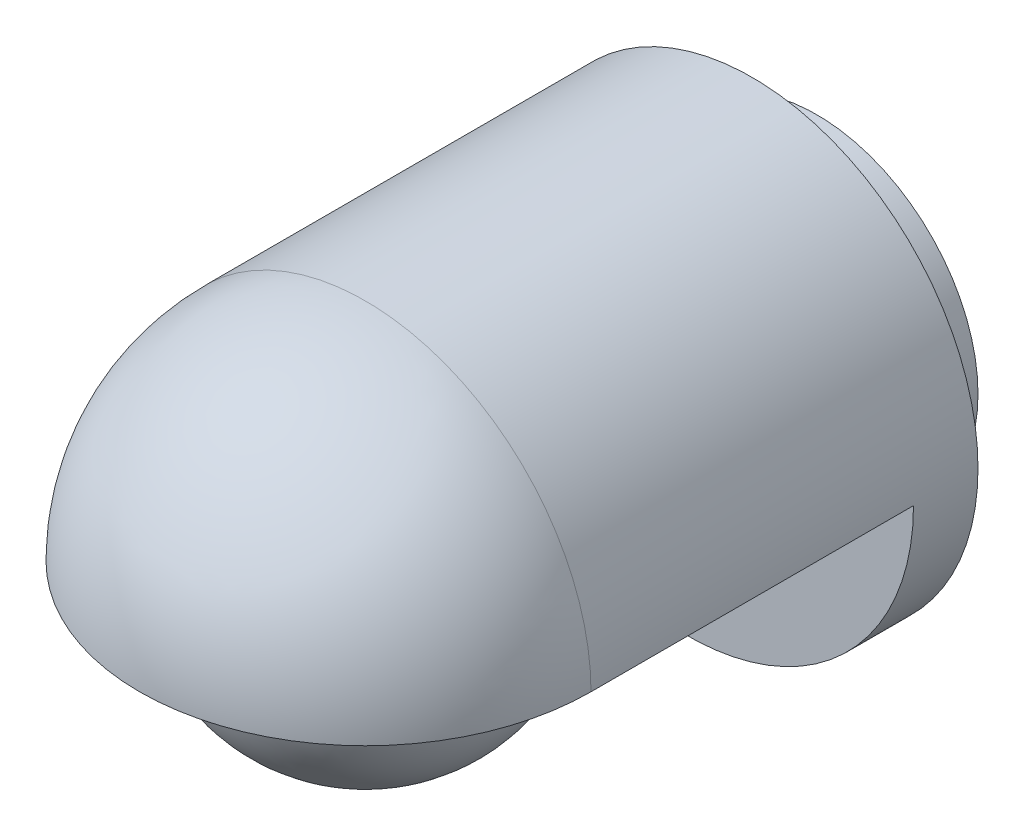
ISO-10303-21;
HEADER;
FILE_DESCRIPTION(('STEP AP214'),'2;1');
FILE_NAME('part.step','',(''),(''),'','','');
FILE_SCHEMA(('AUTOMOTIVE_DESIGN { 1 0 10303 214 1 1 1 1 }'));
ENDSEC;
DATA;
#1=APPLICATION_CONTEXT('core data for automotive mechanical design processes');
#2=APPLICATION_PROTOCOL_DEFINITION('international standard','automotive_design',2000,#1);
#3=PRODUCT_CONTEXT('',#1,'mechanical');
#4=PRODUCT('Part','Part','',(#3));
#5=PRODUCT_RELATED_PRODUCT_CATEGORY('part','',(#4));
#6=PRODUCT_DEFINITION_FORMATION('','',#4);
#7=PRODUCT_DEFINITION_CONTEXT('part definition',#1,'design');
#8=PRODUCT_DEFINITION('design','',#6,#7);
#9=PRODUCT_DEFINITION_SHAPE('','',#8);
#10=(LENGTH_UNIT() NAMED_UNIT(*) SI_UNIT(.MILLI.,.METRE.));
#11=(NAMED_UNIT(*) PLANE_ANGLE_UNIT() SI_UNIT($,.RADIAN.));
#12=(NAMED_UNIT(*) SI_UNIT($,.STERADIAN.) SOLID_ANGLE_UNIT());
#13=UNCERTAINTY_MEASURE_WITH_UNIT(LENGTH_MEASURE(1.E-05),#10,'distance_accuracy_value','');
#14=(GEOMETRIC_REPRESENTATION_CONTEXT(3) GLOBAL_UNCERTAINTY_ASSIGNED_CONTEXT((#13)) GLOBAL_UNIT_ASSIGNED_CONTEXT((#10,
#11,#12)) REPRESENTATION_CONTEXT('',''));
#15=CARTESIAN_POINT('',(0.,0.,0.));
#16=DIRECTION('',(0.,0.,1.));
#17=DIRECTION('',(1.,0.,0.));
#18=AXIS2_PLACEMENT_3D('',#15,#16,#17);
#19=CARTESIAN_POINT('',(0.,0.,0.));
#20=DIRECTION('',(0.,-1.,0.));
#21=DIRECTION('',(0.,0.,1.));
#22=AXIS2_PLACEMENT_3D('',#19,#20,#21);
#23=PLANE('',#22);
#24=CARTESIAN_POINT('',(0.,0.,0.));
#25=DIRECTION('',(0.,-1.,0.));
#26=DIRECTION('',(1.,0.,0.));
#27=AXIS2_PLACEMENT_3D('',#24,#25,#26);
#28=CIRCLE('',#27,50.);
#29=CARTESIAN_POINT('',(50.,-3.49148133884313E-13,0.));
#30=VERTEX_POINT('',#29);
#31=EDGE_CURVE('E42',#30,#30,#28,.F.);
#32=ORIENTED_EDGE('',*,*,#31,.T.);
#33=EDGE_LOOP('',(#32));
#34=FACE_BOUND('',#33,.T.);
#35=DIRECTION('',(0.,0.,-1.));
#36=VECTOR('',#35,1.);
#37=CARTESIAN_POINT('',(-70.,0.,0.));
#38=LINE('',#37,#36);
#39=CARTESIAN_POINT('',(-70.,0.,0.));
#40=VERTEX_POINT('',#39);
#41=CARTESIAN_POINT('',(-70.,4.88807387438039E-13,-100.));
#42=VERTEX_POINT('',#41);
#43=EDGE_CURVE('E67',#40,#42,#38,.T.);
#44=ORIENTED_EDGE('',*,*,#43,.T.);
#45=DIRECTION('',(1.,0.,0.));
#46=VECTOR('',#45,1.);
#47=CARTESIAN_POINT('',(0.,0.,-100.));
#48=LINE('',#47,#46);
#49=CARTESIAN_POINT('',(70.,-4.88807387438039E-13,-100.));
#50=VERTEX_POINT('',#49);
#51=EDGE_CURVE('E11',#42,#50,#48,.T.);
#52=ORIENTED_EDGE('',*,*,#51,.T.);
#53=DIRECTION('',(0.,0.,-1.));
#54=VECTOR('',#53,1.);
#55=CARTESIAN_POINT('',(70.,-4.88807387438039E-13,0.));
#56=LINE('',#55,#54);
#57=CARTESIAN_POINT('',(70.,-4.88807387438039E-13,0.));
#58=VERTEX_POINT('',#57);
#59=EDGE_CURVE('E68',#58,#50,#56,.T.);
#60=ORIENTED_EDGE('',*,*,#59,.F.);
#61=CARTESIAN_POINT('',(0.,0.,0.));
#62=DIRECTION('',(0.,-1.,0.));
#63=DIRECTION('',(0.,0.,1.));
#64=AXIS2_PLACEMENT_3D('',#61,#62,#63);
#65=CIRCLE('',#64,70.);
#66=EDGE_CURVE('E56',#58,#40,#65,.T.);
#67=ORIENTED_EDGE('',*,*,#66,.T.);
#68=EDGE_LOOP('',(#44,#52,#60,#67));
#69=FACE_BOUND('',#68,.T.);
#70=ADVANCED_FACE('F34',(#34,#69),#23,.T.);
#71=CARTESIAN_POINT('',(0.,0.,0.));
#72=DIRECTION('',(0.,0.,-1.));
#73=DIRECTION('',(1.,0.,0.));
#74=AXIS2_PLACEMENT_3D('',#71,#72,#73);
#75=SPHERICAL_SURFACE('',#74,50.);
#76=CARTESIAN_POINT('',(0.,0.,0.));
#77=DIRECTION('',(0.,-1.,0.));
#78=DIRECTION('',(1.,0.,0.));
#79=AXIS2_PLACEMENT_3D('',#76,#77,#78);
#80=SPHERICAL_SURFACE('',#79,50.);
#81=ORIENTED_EDGE('',*,*,#31,.F.);
#82=EDGE_LOOP('',(#81));
#83=FACE_BOUND('',#82,.T.);
#84=ADVANCED_FACE('F36',(#83),#80,.T.);
#85=CARTESIAN_POINT('',(0.,0.,-120.));
#86=DIRECTION('',(0.,0.,1.));
#87=DIRECTION('',(1.,0.,0.));
#88=AXIS2_PLACEMENT_3D('',#85,#86,#87);
#89=CYLINDRICAL_SURFACE('',#88,70.);
#90=CARTESIAN_POINT('',(0.,0.,-120.));
#91=DIRECTION('',(0.,0.,1.));
#92=DIRECTION('',(1.,0.,0.));
#93=AXIS2_PLACEMENT_3D('',#90,#91,#92);
#94=CIRCLE('',#93,70.);
#95=CARTESIAN_POINT('',(70.,0.,-120.));
#96=VERTEX_POINT('',#95);
#97=EDGE_CURVE('E79',#96,#96,#94,.T.);
#98=ORIENTED_EDGE('',*,*,#97,.T.);
#99=EDGE_LOOP('',(#98));
#100=FACE_BOUND('',#99,.T.);
#101=CARTESIAN_POINT('',(0.,0.,-100.));
#102=DIRECTION('',(0.,0.,-1.));
#103=DIRECTION('',(-1.,0.,0.));
#104=AXIS2_PLACEMENT_3D('',#101,#102,#103);
#105=CIRCLE('',#104,70.);
#106=EDGE_CURVE('E65',#50,#42,#105,.T.);
#107=ORIENTED_EDGE('',*,*,#106,.T.);
#108=ORIENTED_EDGE('',*,*,#43,.F.);
#109=CARTESIAN_POINT('',(0.,0.,0.));
#110=DIRECTION('',(0.,0.,1.));
#111=DIRECTION('',(1.,0.,0.));
#112=AXIS2_PLACEMENT_3D('',#109,#110,#111);
#113=CIRCLE('',#112,70.);
#114=EDGE_CURVE('E49',#58,#40,#113,.T.);
#115=ORIENTED_EDGE('',*,*,#114,.F.);
#116=ORIENTED_EDGE('',*,*,#59,.T.);
#117=EDGE_LOOP('',(#107,#108,#115,#116));
#118=FACE_BOUND('',#117,.T.);
#119=ADVANCED_FACE('F66',(#100,#118),#89,.T.);
#120=CARTESIAN_POINT('',(0.,0.,0.));
#121=DIRECTION('',(0.,0.,1.));
#122=DIRECTION('',(1.,0.,0.));
#123=AXIS2_PLACEMENT_3D('',#120,#121,#122);
#124=SPHERICAL_SURFACE('',#123,70.);
#125=ORIENTED_EDGE('',*,*,#114,.T.);
#126=ORIENTED_EDGE('',*,*,#66,.F.);
#127=EDGE_LOOP('',(#125,#126));
#128=FACE_BOUND('',#127,.T.);
#129=ADVANCED_FACE('F91',(#128),#124,.T.);
#130=CARTESIAN_POINT('',(70.,-4.88807387438039E-13,-120.));
#131=DIRECTION('',(0.,0.,-1.));
#132=DIRECTION('',(-1.,0.,0.));
#133=AXIS2_PLACEMENT_3D('',#130,#131,#132);
#134=PLANE('',#133);
#135=ORIENTED_EDGE('',*,*,#97,.F.);
#136=EDGE_LOOP('',(#135));
#137=FACE_BOUND('',#136,.T.);
#138=CARTESIAN_POINT('',(0.,0.,-120.));
#139=DIRECTION('',(0.,0.,-1.));
#140=DIRECTION('',(-1.,0.,0.));
#141=AXIS2_PLACEMENT_3D('',#138,#139,#140);
#142=CIRCLE('',#141,50.);
#143=CARTESIAN_POINT('',(-50.,0.,-120.));
#144=VERTEX_POINT('',#143);
#145=EDGE_CURVE('E69',#144,#144,#142,.T.);
#146=ORIENTED_EDGE('',*,*,#145,.F.);
#147=EDGE_LOOP('',(#146));
#148=FACE_BOUND('',#147,.T.);
#149=ADVANCED_FACE('F101',(#137,#148),#134,.T.);
#150=CARTESIAN_POINT('',(0.,0.,-140.));
#151=DIRECTION('',(0.,0.,1.));
#152=DIRECTION('',(1.,0.,0.));
#153=AXIS2_PLACEMENT_3D('',#150,#151,#152);
#154=CYLINDRICAL_SURFACE('',#153,50.);
#155=CARTESIAN_POINT('',(0.,0.,-140.));
#156=DIRECTION('',(0.,0.,-1.));
#157=DIRECTION('',(-1.,0.,0.));
#158=AXIS2_PLACEMENT_3D('',#155,#156,#157);
#159=CIRCLE('',#158,50.);
#160=CARTESIAN_POINT('',(-50.,0.,-140.));
#161=VERTEX_POINT('',#160);
#162=EDGE_CURVE('E71',#161,#161,#159,.T.);
#163=ORIENTED_EDGE('',*,*,#162,.F.);
#164=EDGE_LOOP('',(#163));
#165=FACE_BOUND('',#164,.T.);
#166=ORIENTED_EDGE('',*,*,#145,.T.);
#167=EDGE_LOOP('',(#166));
#168=FACE_BOUND('',#167,.T.);
#169=ADVANCED_FACE('F98',(#165,#168),#154,.T.);
#170=CARTESIAN_POINT('',(0.,0.,-140.));
#171=DIRECTION('',(0.,0.,-1.));
#172=DIRECTION('',(-1.,0.,0.));
#173=AXIS2_PLACEMENT_3D('',#170,#171,#172);
#174=PLANE('',#173);
#175=ORIENTED_EDGE('',*,*,#162,.T.);
#176=EDGE_LOOP('',(#175));
#177=FACE_BOUND('',#176,.T.);
#178=ADVANCED_FACE('F121',(#177),#174,.T.);
#179=CARTESIAN_POINT('',(0.,0.,-100.));
#180=DIRECTION('',(0.,0.,-1.));
#181=DIRECTION('',(-1.,0.,0.));
#182=AXIS2_PLACEMENT_3D('',#179,#180,#181);
#183=PLANE('',#182);
#184=ORIENTED_EDGE('',*,*,#51,.F.);
#185=ORIENTED_EDGE('',*,*,#106,.F.);
#186=EDGE_LOOP('',(#184,#185));
#187=FACE_BOUND('',#186,.T.);
#188=ADVANCED_FACE('F64',(#187),#183,.F.);
#189=CLOSED_SHELL('',(#70,#84,#119,#129,#149,#169,#178,#188));
#190=MANIFOLD_SOLID_BREP('B2',#189);
#191=ADVANCED_BREP_SHAPE_REPRESENTATION('',(#18,#190),#14);
#192=SHAPE_DEFINITION_REPRESENTATION(#9,#191);
ENDSEC;
END-ISO-10303-21;
